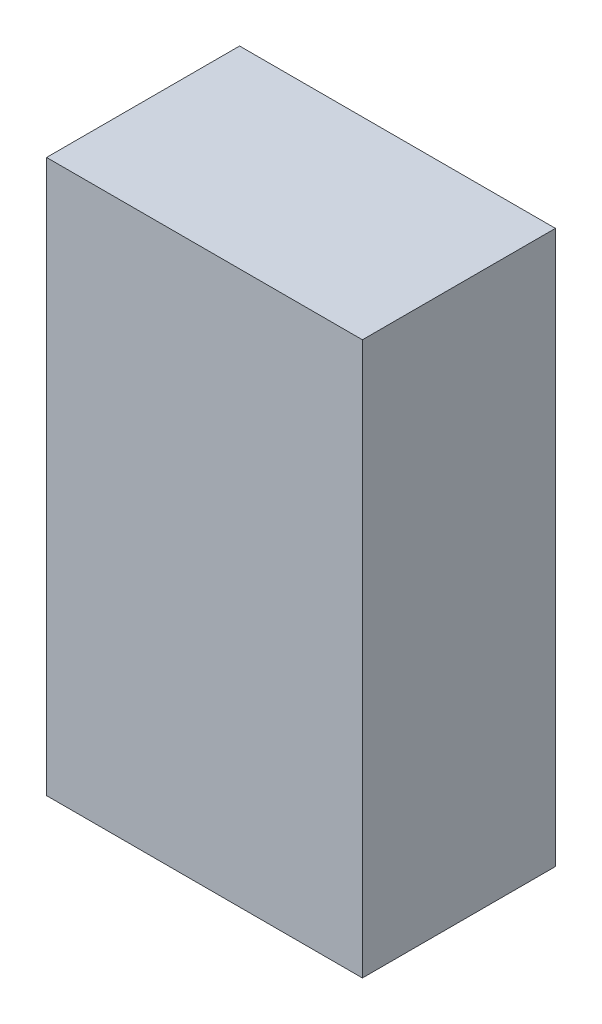
ISO-10303-21;
HEADER;
FILE_DESCRIPTION(('STEP AP214'),'2;1');
FILE_NAME('part.step','',(''),(''),'','','');
FILE_SCHEMA(('AUTOMOTIVE_DESIGN { 1 0 10303 214 1 1 1 1 }'));
ENDSEC;
DATA;
#1=APPLICATION_CONTEXT('core data for automotive mechanical design processes');
#2=APPLICATION_PROTOCOL_DEFINITION('international standard','automotive_design',2000,#1);
#3=PRODUCT_CONTEXT('',#1,'mechanical');
#4=PRODUCT('Part','Part','',(#3));
#5=PRODUCT_RELATED_PRODUCT_CATEGORY('part','',(#4));
#6=PRODUCT_DEFINITION_FORMATION('','',#4);
#7=PRODUCT_DEFINITION_CONTEXT('part definition',#1,'design');
#8=PRODUCT_DEFINITION('design','',#6,#7);
#9=PRODUCT_DEFINITION_SHAPE('','',#8);
#10=(LENGTH_UNIT() NAMED_UNIT(*) SI_UNIT(.MILLI.,.METRE.));
#11=(NAMED_UNIT(*) PLANE_ANGLE_UNIT() SI_UNIT($,.RADIAN.));
#12=(NAMED_UNIT(*) SI_UNIT($,.STERADIAN.) SOLID_ANGLE_UNIT());
#13=UNCERTAINTY_MEASURE_WITH_UNIT(LENGTH_MEASURE(1.E-05),#10,'distance_accuracy_value','');
#14=(GEOMETRIC_REPRESENTATION_CONTEXT(3) GLOBAL_UNCERTAINTY_ASSIGNED_CONTEXT((#13)) GLOBAL_UNIT_ASSIGNED_CONTEXT((#10,
#11,#12)) REPRESENTATION_CONTEXT('',''));
#15=CARTESIAN_POINT('',(0.,0.,0.));
#16=DIRECTION('',(0.,0.,1.));
#17=DIRECTION('',(1.,0.,0.));
#18=AXIS2_PLACEMENT_3D('',#15,#16,#17);
#19=CARTESIAN_POINT('',(0.,0.,0.));
#20=DIRECTION('',(0.,0.,1.));
#21=DIRECTION('',(1.,0.,0.));
#22=AXIS2_PLACEMENT_3D('',#19,#20,#21);
#23=PLANE('',#22);
#24=DIRECTION('',(0.,-1.,0.));
#25=VECTOR('',#24,1.);
#26=CARTESIAN_POINT('',(0.,0.,0.));
#27=LINE('',#26,#25);
#28=CARTESIAN_POINT('',(0.,0.,0.));
#29=VERTEX_POINT('',#28);
#30=CARTESIAN_POINT('',(0.,-63.,0.));
#31=VERTEX_POINT('',#30);
#32=EDGE_CURVE('E104',#29,#31,#27,.T.);
#33=ORIENTED_EDGE('',*,*,#32,.F.);
#34=DIRECTION('',(-1.,0.,0.));
#35=VECTOR('',#34,1.);
#36=CARTESIAN_POINT('',(0.,0.,0.));
#37=LINE('',#36,#35);
#38=CARTESIAN_POINT('',(36.,0.,0.));
#39=VERTEX_POINT('',#38);
#40=EDGE_CURVE('E157',#39,#29,#37,.T.);
#41=ORIENTED_EDGE('',*,*,#40,.F.);
#42=DIRECTION('',(0.,1.,0.));
#43=VECTOR('',#42,1.);
#44=CARTESIAN_POINT('',(36.,0.,0.));
#45=LINE('',#44,#43);
#46=CARTESIAN_POINT('',(36.,-63.,0.));
#47=VERTEX_POINT('',#46);
#48=EDGE_CURVE('E155',#47,#39,#45,.T.);
#49=ORIENTED_EDGE('',*,*,#48,.F.);
#50=DIRECTION('',(1.,0.,0.));
#51=VECTOR('',#50,1.);
#52=CARTESIAN_POINT('',(0.,-63.,0.));
#53=LINE('',#52,#51);
#54=EDGE_CURVE('E153',#31,#47,#53,.T.);
#55=ORIENTED_EDGE('',*,*,#54,.F.);
#56=EDGE_LOOP('',(#33,#41,#49,#55));
#57=FACE_BOUND('',#56,.T.);
#58=DIRECTION('',(0.,-1.,0.));
#59=VECTOR('',#58,1.);
#60=CARTESIAN_POINT('',(2.,-2.,0.));
#61=LINE('',#60,#59);
#62=CARTESIAN_POINT('',(2.,-2.,0.));
#63=VERTEX_POINT('',#62);
#64=CARTESIAN_POINT('',(2.00000000000001,-61.,0.));
#65=VERTEX_POINT('',#64);
#66=EDGE_CURVE('E56',#63,#65,#61,.T.);
#67=ORIENTED_EDGE('',*,*,#66,.T.);
#68=DIRECTION('',(1.,0.,0.));
#69=VECTOR('',#68,1.);
#70=CARTESIAN_POINT('',(2.00000000000001,-61.,0.));
#71=LINE('',#70,#69);
#72=CARTESIAN_POINT('',(34.,-61.,0.));
#73=VERTEX_POINT('',#72);
#74=EDGE_CURVE('E137',#65,#73,#71,.T.);
#75=ORIENTED_EDGE('',*,*,#74,.T.);
#76=DIRECTION('',(0.,1.,0.));
#77=VECTOR('',#76,1.);
#78=CARTESIAN_POINT('',(34.,-2.,0.));
#79=LINE('',#78,#77);
#80=CARTESIAN_POINT('',(34.,-2.,0.));
#81=VERTEX_POINT('',#80);
#82=EDGE_CURVE('E140',#73,#81,#79,.T.);
#83=ORIENTED_EDGE('',*,*,#82,.T.);
#84=DIRECTION('',(-1.,0.,0.));
#85=VECTOR('',#84,1.);
#86=CARTESIAN_POINT('',(2.,-2.,0.));
#87=LINE('',#86,#85);
#88=EDGE_CURVE('E128',#81,#63,#87,.T.);
#89=ORIENTED_EDGE('',*,*,#88,.T.);
#90=EDGE_LOOP('',(#67,#75,#83,#89));
#91=FACE_BOUND('',#90,.T.);
#92=ADVANCED_FACE('F33',(#57,#91),#23,.F.);
#93=CARTESIAN_POINT('',(0.,0.,20.));
#94=DIRECTION('',(1.,0.,0.));
#95=DIRECTION('',(0.,1.,0.));
#96=AXIS2_PLACEMENT_3D('',#93,#94,#95);
#97=PLANE('',#96);
#98=ORIENTED_EDGE('',*,*,#32,.T.);
#99=DIRECTION('',(0.,0.,-1.));
#100=VECTOR('',#99,1.);
#101=CARTESIAN_POINT('',(0.,-63.,20.));
#102=LINE('',#101,#100);
#103=CARTESIAN_POINT('',(0.,-63.,22.));
#104=VERTEX_POINT('',#103);
#105=EDGE_CURVE('E11',#104,#31,#102,.T.);
#106=ORIENTED_EDGE('',*,*,#105,.F.);
#107=DIRECTION('',(0.,1.,0.));
#108=VECTOR('',#107,1.);
#109=CARTESIAN_POINT('',(0.,0.,22.));
#110=LINE('',#109,#108);
#111=CARTESIAN_POINT('',(0.,0.,22.));
#112=VERTEX_POINT('',#111);
#113=EDGE_CURVE('E102',#104,#112,#110,.T.);
#114=ORIENTED_EDGE('',*,*,#113,.T.);
#115=DIRECTION('',(0.,0.,-1.));
#116=VECTOR('',#115,1.);
#117=CARTESIAN_POINT('',(0.,0.,20.));
#118=LINE('',#117,#116);
#119=EDGE_CURVE('E159',#112,#29,#118,.T.);
#120=ORIENTED_EDGE('',*,*,#119,.T.);
#121=EDGE_LOOP('',(#98,#106,#114,#120));
#122=FACE_BOUND('',#121,.T.);
#123=ADVANCED_FACE('F35',(#122),#97,.F.);
#124=CARTESIAN_POINT('',(0.,-63.,20.));
#125=DIRECTION('',(0.,1.,0.));
#126=DIRECTION('',(0.,0.,1.));
#127=AXIS2_PLACEMENT_3D('',#124,#125,#126);
#128=PLANE('',#127);
#129=ORIENTED_EDGE('',*,*,#54,.T.);
#130=DIRECTION('',(0.,0.,-1.));
#131=VECTOR('',#130,1.);
#132=CARTESIAN_POINT('',(36.,-63.,20.));
#133=LINE('',#132,#131);
#134=CARTESIAN_POINT('',(36.,-63.,22.));
#135=VERTEX_POINT('',#134);
#136=EDGE_CURVE('E41',#135,#47,#133,.T.);
#137=ORIENTED_EDGE('',*,*,#136,.F.);
#138=DIRECTION('',(-1.,0.,0.));
#139=VECTOR('',#138,1.);
#140=CARTESIAN_POINT('',(0.,-63.,22.));
#141=LINE('',#140,#139);
#142=EDGE_CURVE('E112',#135,#104,#141,.T.);
#143=ORIENTED_EDGE('',*,*,#142,.T.);
#144=ORIENTED_EDGE('',*,*,#105,.T.);
#145=EDGE_LOOP('',(#129,#137,#143,#144));
#146=FACE_BOUND('',#145,.T.);
#147=ADVANCED_FACE('F116',(#146),#128,.F.);
#148=CARTESIAN_POINT('',(36.,0.,20.));
#149=DIRECTION('',(-1.,0.,0.));
#150=DIRECTION('',(0.,-1.,0.));
#151=AXIS2_PLACEMENT_3D('',#148,#149,#150);
#152=PLANE('',#151);
#153=ORIENTED_EDGE('',*,*,#48,.T.);
#154=DIRECTION('',(0.,0.,-1.));
#155=VECTOR('',#154,1.);
#156=CARTESIAN_POINT('',(36.,0.,20.));
#157=LINE('',#156,#155);
#158=CARTESIAN_POINT('',(36.,0.,22.));
#159=VERTEX_POINT('',#158);
#160=EDGE_CURVE('E161',#159,#39,#157,.T.);
#161=ORIENTED_EDGE('',*,*,#160,.F.);
#162=DIRECTION('',(0.,1.,0.));
#163=VECTOR('',#162,1.);
#164=CARTESIAN_POINT('',(36.,0.,22.));
#165=LINE('',#164,#163);
#166=EDGE_CURVE('E122',#135,#159,#165,.T.);
#167=ORIENTED_EDGE('',*,*,#166,.F.);
#168=ORIENTED_EDGE('',*,*,#136,.T.);
#169=EDGE_LOOP('',(#153,#161,#167,#168));
#170=FACE_BOUND('',#169,.T.);
#171=ADVANCED_FACE('F165',(#170),#152,.F.);
#172=CARTESIAN_POINT('',(0.,0.,20.));
#173=DIRECTION('',(0.,-1.,0.));
#174=DIRECTION('',(0.,0.,-1.));
#175=AXIS2_PLACEMENT_3D('',#172,#173,#174);
#176=PLANE('',#175);
#177=ORIENTED_EDGE('',*,*,#40,.T.);
#178=ORIENTED_EDGE('',*,*,#119,.F.);
#179=DIRECTION('',(-1.,0.,0.));
#180=VECTOR('',#179,1.);
#181=CARTESIAN_POINT('',(0.,0.,22.));
#182=LINE('',#181,#180);
#183=EDGE_CURVE('E114',#159,#112,#182,.T.);
#184=ORIENTED_EDGE('',*,*,#183,.F.);
#185=ORIENTED_EDGE('',*,*,#160,.T.);
#186=EDGE_LOOP('',(#177,#178,#184,#185));
#187=FACE_BOUND('',#186,.T.);
#188=ADVANCED_FACE('F170',(#187),#176,.F.);
#189=CARTESIAN_POINT('',(2.,-2.,20.));
#190=DIRECTION('',(1.,0.,0.));
#191=DIRECTION('',(0.,1.,0.));
#192=AXIS2_PLACEMENT_3D('',#189,#190,#191);
#193=PLANE('',#192);
#194=ORIENTED_EDGE('',*,*,#66,.F.);
#195=DIRECTION('',(0.,0.,-1.));
#196=VECTOR('',#195,1.);
#197=CARTESIAN_POINT('',(2.,-2.,20.));
#198=LINE('',#197,#196);
#199=CARTESIAN_POINT('',(2.,-2.,20.));
#200=VERTEX_POINT('',#199);
#201=EDGE_CURVE('E135',#200,#63,#198,.T.);
#202=ORIENTED_EDGE('',*,*,#201,.F.);
#203=DIRECTION('',(0.,-1.,0.));
#204=VECTOR('',#203,1.);
#205=CARTESIAN_POINT('',(2.,-2.,20.));
#206=LINE('',#205,#204);
#207=CARTESIAN_POINT('',(2.00000000000001,-61.,20.));
#208=VERTEX_POINT('',#207);
#209=EDGE_CURVE('E124',#200,#208,#206,.T.);
#210=ORIENTED_EDGE('',*,*,#209,.T.);
#211=DIRECTION('',(0.,0.,-1.));
#212=VECTOR('',#211,1.);
#213=CARTESIAN_POINT('',(2.00000000000001,-61.,20.));
#214=LINE('',#213,#212);
#215=EDGE_CURVE('E150',#208,#65,#214,.T.);
#216=ORIENTED_EDGE('',*,*,#215,.T.);
#217=EDGE_LOOP('',(#194,#202,#210,#216));
#218=FACE_BOUND('',#217,.T.);
#219=ADVANCED_FACE('F172',(#218),#193,.T.);
#220=CARTESIAN_POINT('',(2.00000000000001,-61.,20.));
#221=DIRECTION('',(0.,1.,0.));
#222=DIRECTION('',(0.,0.,1.));
#223=AXIS2_PLACEMENT_3D('',#220,#221,#222);
#224=PLANE('',#223);
#225=ORIENTED_EDGE('',*,*,#74,.F.);
#226=ORIENTED_EDGE('',*,*,#215,.F.);
#227=DIRECTION('',(1.,0.,0.));
#228=VECTOR('',#227,1.);
#229=CARTESIAN_POINT('',(2.00000000000001,-61.,20.));
#230=LINE('',#229,#228);
#231=CARTESIAN_POINT('',(34.,-61.,20.));
#232=VERTEX_POINT('',#231);
#233=EDGE_CURVE('E127',#208,#232,#230,.T.);
#234=ORIENTED_EDGE('',*,*,#233,.T.);
#235=DIRECTION('',(0.,0.,-1.));
#236=VECTOR('',#235,1.);
#237=CARTESIAN_POINT('',(34.,-61.,20.));
#238=LINE('',#237,#236);
#239=EDGE_CURVE('E148',#232,#73,#238,.T.);
#240=ORIENTED_EDGE('',*,*,#239,.T.);
#241=EDGE_LOOP('',(#225,#226,#234,#240));
#242=FACE_BOUND('',#241,.T.);
#243=ADVANCED_FACE('F178',(#242),#224,.T.);
#244=CARTESIAN_POINT('',(34.,-2.,20.));
#245=DIRECTION('',(-1.,0.,0.));
#246=DIRECTION('',(0.,-1.,0.));
#247=AXIS2_PLACEMENT_3D('',#244,#245,#246);
#248=PLANE('',#247);
#249=ORIENTED_EDGE('',*,*,#82,.F.);
#250=ORIENTED_EDGE('',*,*,#239,.F.);
#251=DIRECTION('',(0.,1.,0.));
#252=VECTOR('',#251,1.);
#253=CARTESIAN_POINT('',(34.,-2.,20.));
#254=LINE('',#253,#252);
#255=CARTESIAN_POINT('',(34.,-2.,20.));
#256=VERTEX_POINT('',#255);
#257=EDGE_CURVE('E131',#232,#256,#254,.T.);
#258=ORIENTED_EDGE('',*,*,#257,.T.);
#259=DIRECTION('',(0.,0.,-1.));
#260=VECTOR('',#259,1.);
#261=CARTESIAN_POINT('',(34.,-2.,20.));
#262=LINE('',#261,#260);
#263=EDGE_CURVE('E146',#256,#81,#262,.T.);
#264=ORIENTED_EDGE('',*,*,#263,.T.);
#265=EDGE_LOOP('',(#249,#250,#258,#264));
#266=FACE_BOUND('',#265,.T.);
#267=ADVANCED_FACE('F189',(#266),#248,.T.);
#268=CARTESIAN_POINT('',(2.,-2.,20.));
#269=DIRECTION('',(0.,-1.,0.));
#270=DIRECTION('',(0.,0.,-1.));
#271=AXIS2_PLACEMENT_3D('',#268,#269,#270);
#272=PLANE('',#271);
#273=ORIENTED_EDGE('',*,*,#88,.F.);
#274=ORIENTED_EDGE('',*,*,#263,.F.);
#275=DIRECTION('',(-1.,0.,0.));
#276=VECTOR('',#275,1.);
#277=CARTESIAN_POINT('',(2.,-2.,20.));
#278=LINE('',#277,#276);
#279=EDGE_CURVE('E48',#256,#200,#278,.T.);
#280=ORIENTED_EDGE('',*,*,#279,.T.);
#281=ORIENTED_EDGE('',*,*,#201,.T.);
#282=EDGE_LOOP('',(#273,#274,#280,#281));
#283=FACE_BOUND('',#282,.T.);
#284=ADVANCED_FACE('F193',(#283),#272,.T.);
#285=CARTESIAN_POINT('',(0.,0.,20.));
#286=DIRECTION('',(0.,0.,-1.));
#287=DIRECTION('',(-1.,0.,0.));
#288=AXIS2_PLACEMENT_3D('',#285,#286,#287);
#289=PLANE('',#288);
#290=ORIENTED_EDGE('',*,*,#233,.F.);
#291=ORIENTED_EDGE('',*,*,#209,.F.);
#292=ORIENTED_EDGE('',*,*,#279,.F.);
#293=ORIENTED_EDGE('',*,*,#257,.F.);
#294=EDGE_LOOP('',(#290,#291,#292,#293));
#295=FACE_BOUND('',#294,.T.);
#296=ADVANCED_FACE('F197',(#295),#289,.T.);
#297=CARTESIAN_POINT('',(0.,0.,22.));
#298=DIRECTION('',(0.,0.,-1.));
#299=DIRECTION('',(-1.,0.,0.));
#300=AXIS2_PLACEMENT_3D('',#297,#298,#299);
#301=PLANE('',#300);
#302=ORIENTED_EDGE('',*,*,#142,.F.);
#303=ORIENTED_EDGE('',*,*,#166,.T.);
#304=ORIENTED_EDGE('',*,*,#183,.T.);
#305=ORIENTED_EDGE('',*,*,#113,.F.);
#306=EDGE_LOOP('',(#302,#303,#304,#305));
#307=FACE_BOUND('',#306,.T.);
#308=ADVANCED_FACE('F110',(#307),#301,.F.);
#309=CLOSED_SHELL('',(#92,#123,#147,#171,#188,#219,#243,#267,#284,#296,#308));
#310=MANIFOLD_SOLID_BREP('B2',#309);
#311=ADVANCED_BREP_SHAPE_REPRESENTATION('',(#18,#310),#14);
#312=SHAPE_DEFINITION_REPRESENTATION(#9,#311);
ENDSEC;
END-ISO-10303-21;
